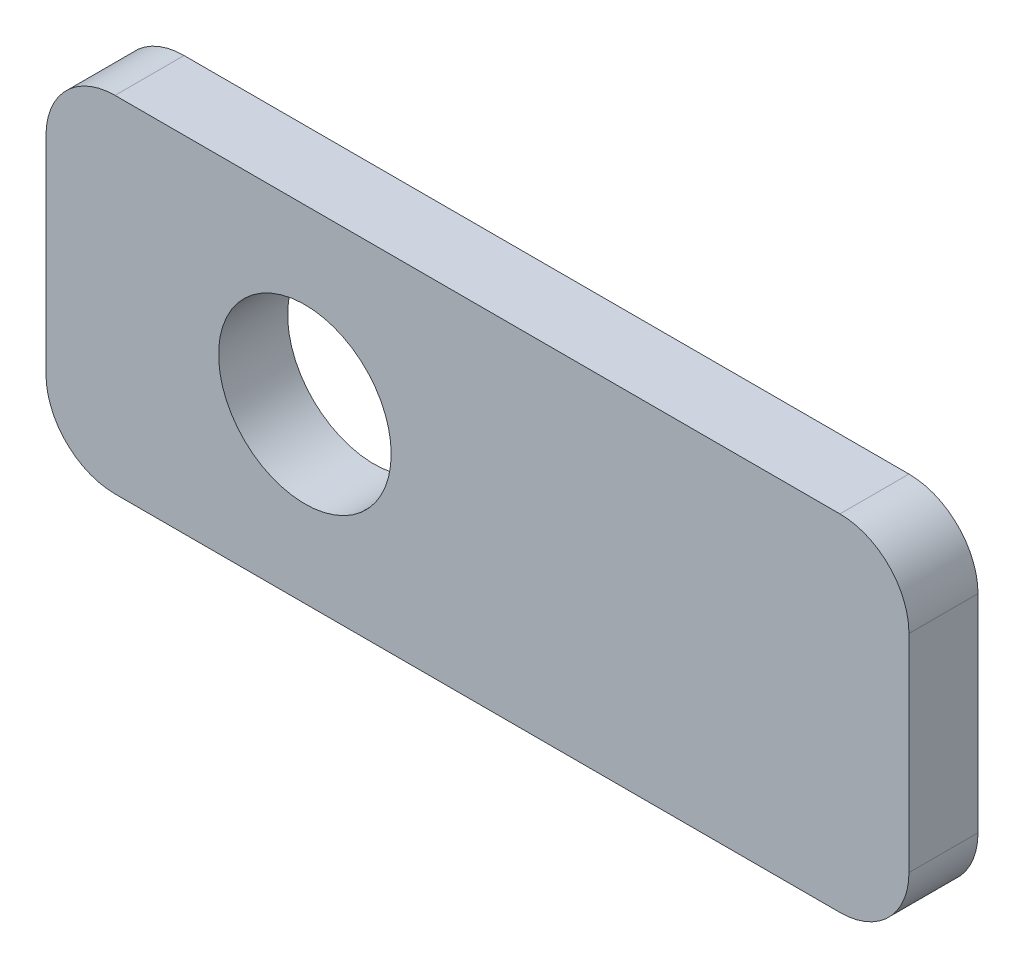
ISO-10303-21;
HEADER;
FILE_DESCRIPTION(('STEP AP214'),'2;1');
FILE_NAME('part.step','',(''),(''),'','','');
FILE_SCHEMA(('AUTOMOTIVE_DESIGN { 1 0 10303 214 1 1 1 1 }'));
ENDSEC;
DATA;
#1=APPLICATION_CONTEXT('core data for automotive mechanical design processes');
#2=APPLICATION_PROTOCOL_DEFINITION('international standard','automotive_design',2000,#1);
#3=PRODUCT_CONTEXT('',#1,'mechanical');
#4=PRODUCT('Part','Part','',(#3));
#5=PRODUCT_RELATED_PRODUCT_CATEGORY('part','',(#4));
#6=PRODUCT_DEFINITION_FORMATION('','',#4);
#7=PRODUCT_DEFINITION_CONTEXT('part definition',#1,'design');
#8=PRODUCT_DEFINITION('design','',#6,#7);
#9=PRODUCT_DEFINITION_SHAPE('','',#8);
#10=(LENGTH_UNIT() NAMED_UNIT(*) SI_UNIT(.MILLI.,.METRE.));
#11=(NAMED_UNIT(*) PLANE_ANGLE_UNIT() SI_UNIT($,.RADIAN.));
#12=(NAMED_UNIT(*) SI_UNIT($,.STERADIAN.) SOLID_ANGLE_UNIT());
#13=UNCERTAINTY_MEASURE_WITH_UNIT(LENGTH_MEASURE(1.E-05),#10,'distance_accuracy_value','');
#14=(GEOMETRIC_REPRESENTATION_CONTEXT(3) GLOBAL_UNCERTAINTY_ASSIGNED_CONTEXT((#13)) GLOBAL_UNIT_ASSIGNED_CONTEXT((#10,
#11,#12)) REPRESENTATION_CONTEXT('',''));
#15=CARTESIAN_POINT('',(0.,0.,0.));
#16=DIRECTION('',(0.,0.,1.));
#17=DIRECTION('',(1.,0.,0.));
#18=AXIS2_PLACEMENT_3D('',#15,#16,#17);
#19=CARTESIAN_POINT('',(29.21,2.54,2.54));
#20=DIRECTION('',(0.,0.,1.));
#21=DIRECTION('',(1.,0.,0.));
#22=AXIS2_PLACEMENT_3D('',#19,#20,#21);
#23=PLANE('',#22);
#24=CARTESIAN_POINT('',(29.21,2.54,2.54));
#25=DIRECTION('',(0.,0.,1.));
#26=DIRECTION('',(1.,0.,0.));
#27=AXIS2_PLACEMENT_3D('',#24,#25,#26);
#28=CIRCLE('',#27,2.54);
#29=CARTESIAN_POINT('',(29.21,0.,2.54));
#30=VERTEX_POINT('',#29);
#31=CARTESIAN_POINT('',(31.75,2.54,2.54));
#32=VERTEX_POINT('',#31);
#33=EDGE_CURVE('E147',#30,#32,#28,.T.);
#34=ORIENTED_EDGE('',*,*,#33,.T.);
#35=DIRECTION('',(0.,1.,0.));
#36=VECTOR('',#35,1.);
#37=CARTESIAN_POINT('',(31.75,2.54,2.54));
#38=LINE('',#37,#36);
#39=CARTESIAN_POINT('',(31.75,10.16,2.54));
#40=VERTEX_POINT('',#39);
#41=EDGE_CURVE('E95',#32,#40,#38,.T.);
#42=ORIENTED_EDGE('',*,*,#41,.T.);
#43=CARTESIAN_POINT('',(29.21,10.16,2.54));
#44=DIRECTION('',(0.,0.,1.));
#45=DIRECTION('',(-1.,0.,0.));
#46=AXIS2_PLACEMENT_3D('',#43,#44,#45);
#47=CIRCLE('',#46,2.54);
#48=CARTESIAN_POINT('',(29.21,12.7,2.54));
#49=VERTEX_POINT('',#48);
#50=EDGE_CURVE('E162',#40,#49,#47,.T.);
#51=ORIENTED_EDGE('',*,*,#50,.T.);
#52=DIRECTION('',(-1.,0.,0.));
#53=VECTOR('',#52,1.);
#54=CARTESIAN_POINT('',(2.54000000000002,12.7,2.54));
#55=LINE('',#54,#53);
#56=CARTESIAN_POINT('',(2.54000000000002,12.7,2.54));
#57=VERTEX_POINT('',#56);
#58=EDGE_CURVE('E175',#49,#57,#55,.T.);
#59=ORIENTED_EDGE('',*,*,#58,.T.);
#60=CARTESIAN_POINT('',(2.54,10.16,2.54));
#61=DIRECTION('',(0.,0.,1.));
#62=DIRECTION('',(-1.,0.,0.));
#63=AXIS2_PLACEMENT_3D('',#60,#61,#62);
#64=CIRCLE('',#63,2.54);
#65=CARTESIAN_POINT('',(0.,10.16,2.54));
#66=VERTEX_POINT('',#65);
#67=EDGE_CURVE('E114',#57,#66,#64,.T.);
#68=ORIENTED_EDGE('',*,*,#67,.T.);
#69=DIRECTION('',(0.,-1.,0.));
#70=VECTOR('',#69,1.);
#71=CARTESIAN_POINT('',(0.,2.54000000000002,2.54));
#72=LINE('',#71,#70);
#73=CARTESIAN_POINT('',(0.,2.54000000000002,2.54));
#74=VERTEX_POINT('',#73);
#75=EDGE_CURVE('E108',#66,#74,#72,.T.);
#76=ORIENTED_EDGE('',*,*,#75,.T.);
#77=CARTESIAN_POINT('',(2.54,2.54,2.54));
#78=DIRECTION('',(0.,0.,1.));
#79=DIRECTION('',(-1.,0.,0.));
#80=AXIS2_PLACEMENT_3D('',#77,#78,#79);
#81=CIRCLE('',#80,2.54);
#82=CARTESIAN_POINT('',(2.54000000000002,0.,2.54));
#83=VERTEX_POINT('',#82);
#84=EDGE_CURVE('E112',#74,#83,#81,.T.);
#85=ORIENTED_EDGE('',*,*,#84,.T.);
#86=DIRECTION('',(1.,0.,0.));
#87=VECTOR('',#86,1.);
#88=CARTESIAN_POINT('',(2.54000000000002,0.,2.54));
#89=LINE('',#88,#87);
#90=EDGE_CURVE('E52',#83,#30,#89,.T.);
#91=ORIENTED_EDGE('',*,*,#90,.T.);
#92=EDGE_LOOP('',(#34,#42,#51,#59,#68,#76,#85,#91));
#93=FACE_BOUND('',#92,.T.);
#94=CARTESIAN_POINT('',(9.525,6.35,2.54));
#95=DIRECTION('',(0.,0.,1.));
#96=DIRECTION('',(1.,0.,0.));
#97=AXIS2_PLACEMENT_3D('',#94,#95,#96);
#98=CIRCLE('',#97,3.175);
#99=CARTESIAN_POINT('',(12.7,6.35,2.54));
#100=VERTEX_POINT('',#99);
#101=EDGE_CURVE('E136',#100,#100,#98,.T.);
#102=ORIENTED_EDGE('',*,*,#101,.F.);
#103=EDGE_LOOP('',(#102));
#104=FACE_BOUND('',#103,.T.);
#105=ADVANCED_FACE('F35',(#93,#104),#23,.T.);
#106=CARTESIAN_POINT('',(29.21,2.54,0.));
#107=DIRECTION('',(0.,0.,1.));
#108=DIRECTION('',(1.,0.,0.));
#109=AXIS2_PLACEMENT_3D('',#106,#107,#108);
#110=PLANE('',#109);
#111=CARTESIAN_POINT('',(29.21,2.54,0.));
#112=DIRECTION('',(0.,0.,1.));
#113=DIRECTION('',(1.,0.,0.));
#114=AXIS2_PLACEMENT_3D('',#111,#112,#113);
#115=CIRCLE('',#114,2.54);
#116=CARTESIAN_POINT('',(29.21,0.,0.));
#117=VERTEX_POINT('',#116);
#118=CARTESIAN_POINT('',(31.75,2.54,0.));
#119=VERTEX_POINT('',#118);
#120=EDGE_CURVE('E132',#117,#119,#115,.T.);
#121=ORIENTED_EDGE('',*,*,#120,.F.);
#122=DIRECTION('',(1.,0.,0.));
#123=VECTOR('',#122,1.);
#124=CARTESIAN_POINT('',(2.54000000000002,0.,0.));
#125=LINE('',#124,#123);
#126=CARTESIAN_POINT('',(2.54000000000002,0.,0.));
#127=VERTEX_POINT('',#126);
#128=EDGE_CURVE('E87',#127,#117,#125,.T.);
#129=ORIENTED_EDGE('',*,*,#128,.F.);
#130=CARTESIAN_POINT('',(2.54,2.54,0.));
#131=DIRECTION('',(0.,0.,1.));
#132=DIRECTION('',(-1.,0.,0.));
#133=AXIS2_PLACEMENT_3D('',#130,#131,#132);
#134=CIRCLE('',#133,2.54);
#135=CARTESIAN_POINT('',(0.,2.54000000000002,0.));
#136=VERTEX_POINT('',#135);
#137=EDGE_CURVE('E81',#136,#127,#134,.T.);
#138=ORIENTED_EDGE('',*,*,#137,.F.);
#139=DIRECTION('',(0.,-1.,0.));
#140=VECTOR('',#139,1.);
#141=CARTESIAN_POINT('',(0.,2.54000000000002,0.));
#142=LINE('',#141,#140);
#143=CARTESIAN_POINT('',(0.,10.16,0.));
#144=VERTEX_POINT('',#143);
#145=EDGE_CURVE('E122',#144,#136,#142,.T.);
#146=ORIENTED_EDGE('',*,*,#145,.F.);
#147=CARTESIAN_POINT('',(2.54,10.16,0.));
#148=DIRECTION('',(0.,0.,1.));
#149=DIRECTION('',(-1.,0.,0.));
#150=AXIS2_PLACEMENT_3D('',#147,#148,#149);
#151=CIRCLE('',#150,2.54);
#152=CARTESIAN_POINT('',(2.54000000000002,12.7,0.));
#153=VERTEX_POINT('',#152);
#154=EDGE_CURVE('E142',#153,#144,#151,.T.);
#155=ORIENTED_EDGE('',*,*,#154,.F.);
#156=DIRECTION('',(-1.,0.,0.));
#157=VECTOR('',#156,1.);
#158=CARTESIAN_POINT('',(2.54000000000002,12.7,0.));
#159=LINE('',#158,#157);
#160=CARTESIAN_POINT('',(29.21,12.7,0.));
#161=VERTEX_POINT('',#160);
#162=EDGE_CURVE('E140',#161,#153,#159,.T.);
#163=ORIENTED_EDGE('',*,*,#162,.F.);
#164=CARTESIAN_POINT('',(29.21,10.16,0.));
#165=DIRECTION('',(0.,0.,1.));
#166=DIRECTION('',(-1.,0.,0.));
#167=AXIS2_PLACEMENT_3D('',#164,#165,#166);
#168=CIRCLE('',#167,2.54);
#169=CARTESIAN_POINT('',(31.75,10.16,0.));
#170=VERTEX_POINT('',#169);
#171=EDGE_CURVE('E138',#170,#161,#168,.T.);
#172=ORIENTED_EDGE('',*,*,#171,.F.);
#173=DIRECTION('',(0.,1.,0.));
#174=VECTOR('',#173,1.);
#175=CARTESIAN_POINT('',(31.75,2.54,0.));
#176=LINE('',#175,#174);
#177=EDGE_CURVE('E135',#119,#170,#176,.T.);
#178=ORIENTED_EDGE('',*,*,#177,.F.);
#179=EDGE_LOOP('',(#121,#129,#138,#146,#155,#163,#172,#178));
#180=FACE_BOUND('',#179,.T.);
#181=CARTESIAN_POINT('',(9.525,6.35,0.));
#182=DIRECTION('',(0.,0.,1.));
#183=DIRECTION('',(1.,0.,0.));
#184=AXIS2_PLACEMENT_3D('',#181,#182,#183);
#185=CIRCLE('',#184,3.175);
#186=CARTESIAN_POINT('',(12.7,6.35,0.));
#187=VERTEX_POINT('',#186);
#188=EDGE_CURVE('E181',#187,#187,#185,.T.);
#189=ORIENTED_EDGE('',*,*,#188,.T.);
#190=EDGE_LOOP('',(#189));
#191=FACE_BOUND('',#190,.T.);
#192=ADVANCED_FACE('F166',(#180,#191),#110,.F.);
#193=CARTESIAN_POINT('',(29.21,2.54,2.54));
#194=DIRECTION('',(0.,0.,-1.));
#195=DIRECTION('',(-1.,0.,0.));
#196=AXIS2_PLACEMENT_3D('',#193,#194,#195);
#197=CYLINDRICAL_SURFACE('',#196,2.54);
#198=ORIENTED_EDGE('',*,*,#120,.T.);
#199=DIRECTION('',(0.,0.,-1.));
#200=VECTOR('',#199,1.);
#201=CARTESIAN_POINT('',(31.75,2.54,2.54));
#202=LINE('',#201,#200);
#203=EDGE_CURVE('E11',#32,#119,#202,.T.);
#204=ORIENTED_EDGE('',*,*,#203,.F.);
#205=ORIENTED_EDGE('',*,*,#33,.F.);
#206=DIRECTION('',(0.,0.,-1.));
#207=VECTOR('',#206,1.);
#208=CARTESIAN_POINT('',(29.21,0.,2.54));
#209=LINE('',#208,#207);
#210=EDGE_CURVE('E128',#30,#117,#209,.T.);
#211=ORIENTED_EDGE('',*,*,#210,.T.);
#212=EDGE_LOOP('',(#198,#204,#205,#211));
#213=FACE_BOUND('',#212,.T.);
#214=ADVANCED_FACE('F37',(#213),#197,.T.);
#215=CARTESIAN_POINT('',(31.75,2.54,2.54));
#216=DIRECTION('',(-1.,0.,0.));
#217=DIRECTION('',(0.,0.,1.));
#218=AXIS2_PLACEMENT_3D('',#215,#216,#217);
#219=PLANE('',#218);
#220=ORIENTED_EDGE('',*,*,#177,.T.);
#221=DIRECTION('',(0.,0.,-1.));
#222=VECTOR('',#221,1.);
#223=CARTESIAN_POINT('',(31.75,10.16,2.54));
#224=LINE('',#223,#222);
#225=EDGE_CURVE('E44',#40,#170,#224,.T.);
#226=ORIENTED_EDGE('',*,*,#225,.F.);
#227=ORIENTED_EDGE('',*,*,#41,.F.);
#228=ORIENTED_EDGE('',*,*,#203,.T.);
#229=EDGE_LOOP('',(#220,#226,#227,#228));
#230=FACE_BOUND('',#229,.T.);
#231=ADVANCED_FACE('F209',(#230),#219,.F.);
#232=CARTESIAN_POINT('',(29.21,10.16,2.54));
#233=DIRECTION('',(0.,0.,-1.));
#234=DIRECTION('',(-1.,0.,0.));
#235=AXIS2_PLACEMENT_3D('',#232,#233,#234);
#236=CYLINDRICAL_SURFACE('',#235,2.54);
#237=ORIENTED_EDGE('',*,*,#171,.T.);
#238=DIRECTION('',(0.,0.,-1.));
#239=VECTOR('',#238,1.);
#240=CARTESIAN_POINT('',(29.21,12.7,2.54));
#241=LINE('',#240,#239);
#242=EDGE_CURVE('E154',#49,#161,#241,.T.);
#243=ORIENTED_EDGE('',*,*,#242,.F.);
#244=ORIENTED_EDGE('',*,*,#50,.F.);
#245=ORIENTED_EDGE('',*,*,#225,.T.);
#246=EDGE_LOOP('',(#237,#243,#244,#245));
#247=FACE_BOUND('',#246,.T.);
#248=ADVANCED_FACE('F160',(#247),#236,.T.);
#249=CARTESIAN_POINT('',(2.54000000000002,12.7,2.54));
#250=DIRECTION('',(0.,-1.,0.));
#251=DIRECTION('',(0.,0.,-1.));
#252=AXIS2_PLACEMENT_3D('',#249,#250,#251);
#253=PLANE('',#252);
#254=ORIENTED_EDGE('',*,*,#162,.T.);
#255=DIRECTION('',(0.,0.,-1.));
#256=VECTOR('',#255,1.);
#257=CARTESIAN_POINT('',(2.54000000000002,12.7,2.54));
#258=LINE('',#257,#256);
#259=EDGE_CURVE('E151',#57,#153,#258,.T.);
#260=ORIENTED_EDGE('',*,*,#259,.F.);
#261=ORIENTED_EDGE('',*,*,#58,.F.);
#262=ORIENTED_EDGE('',*,*,#242,.T.);
#263=EDGE_LOOP('',(#254,#260,#261,#262));
#264=FACE_BOUND('',#263,.T.);
#265=ADVANCED_FACE('F171',(#264),#253,.F.);
#266=CARTESIAN_POINT('',(2.54,10.16,2.54));
#267=DIRECTION('',(0.,0.,-1.));
#268=DIRECTION('',(-1.,0.,0.));
#269=AXIS2_PLACEMENT_3D('',#266,#267,#268);
#270=CYLINDRICAL_SURFACE('',#269,2.54);
#271=ORIENTED_EDGE('',*,*,#154,.T.);
#272=DIRECTION('',(0.,0.,-1.));
#273=VECTOR('',#272,1.);
#274=CARTESIAN_POINT('',(0.,10.16,2.54));
#275=LINE('',#274,#273);
#276=EDGE_CURVE('E123',#66,#144,#275,.T.);
#277=ORIENTED_EDGE('',*,*,#276,.F.);
#278=ORIENTED_EDGE('',*,*,#67,.F.);
#279=ORIENTED_EDGE('',*,*,#259,.T.);
#280=EDGE_LOOP('',(#271,#277,#278,#279));
#281=FACE_BOUND('',#280,.T.);
#282=ADVANCED_FACE('F174',(#281),#270,.T.);
#283=CARTESIAN_POINT('',(0.,2.54000000000002,2.54));
#284=DIRECTION('',(1.,0.,0.));
#285=DIRECTION('',(0.,0.,-1.));
#286=AXIS2_PLACEMENT_3D('',#283,#284,#285);
#287=PLANE('',#286);
#288=ORIENTED_EDGE('',*,*,#145,.T.);
#289=DIRECTION('',(0.,0.,-1.));
#290=VECTOR('',#289,1.);
#291=CARTESIAN_POINT('',(0.,2.54000000000002,2.54));
#292=LINE('',#291,#290);
#293=EDGE_CURVE('E119',#74,#136,#292,.T.);
#294=ORIENTED_EDGE('',*,*,#293,.F.);
#295=ORIENTED_EDGE('',*,*,#75,.F.);
#296=ORIENTED_EDGE('',*,*,#276,.T.);
#297=EDGE_LOOP('',(#288,#294,#295,#296));
#298=FACE_BOUND('',#297,.T.);
#299=ADVANCED_FACE('F120',(#298),#287,.F.);
#300=CARTESIAN_POINT('',(2.54,2.54,2.54));
#301=DIRECTION('',(0.,0.,-1.));
#302=DIRECTION('',(-1.,0.,0.));
#303=AXIS2_PLACEMENT_3D('',#300,#301,#302);
#304=CYLINDRICAL_SURFACE('',#303,2.54);
#305=ORIENTED_EDGE('',*,*,#137,.T.);
#306=DIRECTION('',(0.,0.,-1.));
#307=VECTOR('',#306,1.);
#308=CARTESIAN_POINT('',(2.54000000000002,0.,2.54));
#309=LINE('',#308,#307);
#310=EDGE_CURVE('E124',#83,#127,#309,.T.);
#311=ORIENTED_EDGE('',*,*,#310,.F.);
#312=ORIENTED_EDGE('',*,*,#84,.F.);
#313=ORIENTED_EDGE('',*,*,#293,.T.);
#314=EDGE_LOOP('',(#305,#311,#312,#313));
#315=FACE_BOUND('',#314,.T.);
#316=ADVANCED_FACE('F126',(#315),#304,.T.);
#317=CARTESIAN_POINT('',(2.54000000000002,0.,2.54));
#318=DIRECTION('',(0.,1.,0.));
#319=DIRECTION('',(0.,0.,1.));
#320=AXIS2_PLACEMENT_3D('',#317,#318,#319);
#321=PLANE('',#320);
#322=ORIENTED_EDGE('',*,*,#128,.T.);
#323=ORIENTED_EDGE('',*,*,#210,.F.);
#324=ORIENTED_EDGE('',*,*,#90,.F.);
#325=ORIENTED_EDGE('',*,*,#310,.T.);
#326=EDGE_LOOP('',(#322,#323,#324,#325));
#327=FACE_BOUND('',#326,.T.);
#328=ADVANCED_FACE('F197',(#327),#321,.F.);
#329=CARTESIAN_POINT('',(9.525,6.35,2.54));
#330=DIRECTION('',(0.,0.,-1.));
#331=DIRECTION('',(-1.,0.,0.));
#332=AXIS2_PLACEMENT_3D('',#329,#330,#331);
#333=CYLINDRICAL_SURFACE('',#332,3.175);
#334=ORIENTED_EDGE('',*,*,#101,.T.);
#335=EDGE_LOOP('',(#334));
#336=FACE_BOUND('',#335,.T.);
#337=ORIENTED_EDGE('',*,*,#188,.F.);
#338=EDGE_LOOP('',(#337));
#339=FACE_BOUND('',#338,.T.);
#340=ADVANCED_FACE('F187',(#336,#339),#333,.F.);
#341=CLOSED_SHELL('',(#105,#192,#214,#231,#248,#265,#282,#299,#316,#328,#340));
#342=MANIFOLD_SOLID_BREP('B2',#341);
#343=ADVANCED_BREP_SHAPE_REPRESENTATION('',(#18,#342),#14);
#344=SHAPE_DEFINITION_REPRESENTATION(#9,#343);
ENDSEC;
END-ISO-10303-21;
